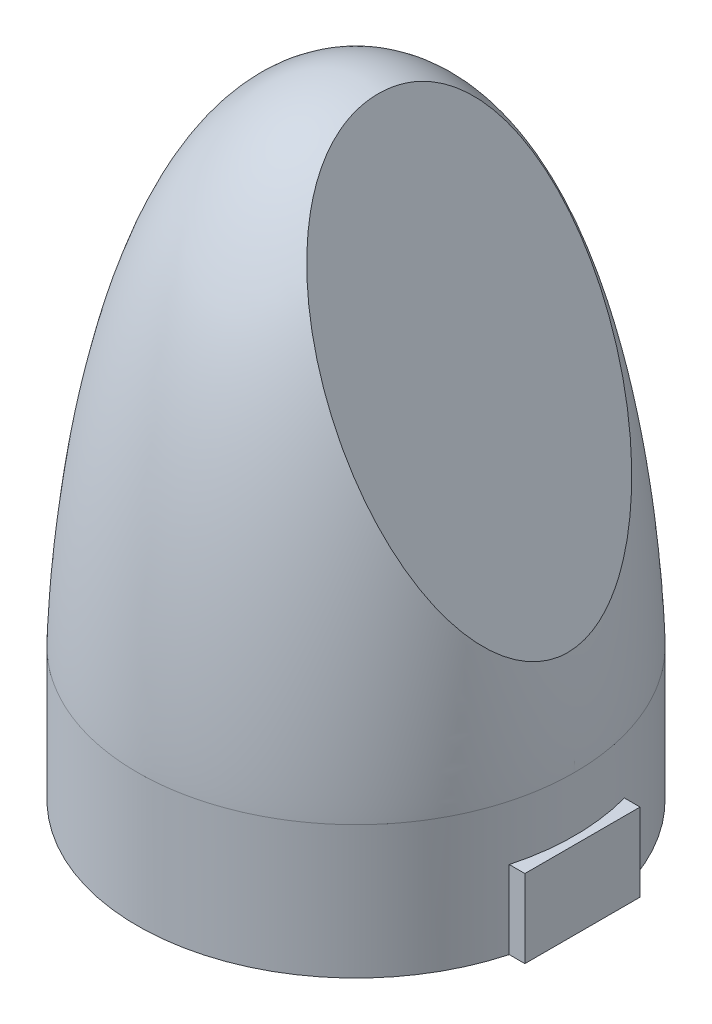
ISO-10303-21;
HEADER;
FILE_DESCRIPTION(('STEP AP214'),'2;1');
FILE_NAME('part.step','',(''),(''),'','','');
FILE_SCHEMA(('AUTOMOTIVE_DESIGN { 1 0 10303 214 1 1 1 1 }'));
ENDSEC;
DATA;
#1=APPLICATION_CONTEXT('core data for automotive mechanical design processes');
#2=APPLICATION_PROTOCOL_DEFINITION('international standard','automotive_design',2000,#1);
#3=PRODUCT_CONTEXT('',#1,'mechanical');
#4=PRODUCT('Part','Part','',(#3));
#5=PRODUCT_RELATED_PRODUCT_CATEGORY('part','',(#4));
#6=PRODUCT_DEFINITION_FORMATION('','',#4);
#7=PRODUCT_DEFINITION_CONTEXT('part definition',#1,'design');
#8=PRODUCT_DEFINITION('design','',#6,#7);
#9=PRODUCT_DEFINITION_SHAPE('','',#8);
#10=(LENGTH_UNIT() NAMED_UNIT(*) SI_UNIT(.MILLI.,.METRE.));
#11=(NAMED_UNIT(*) PLANE_ANGLE_UNIT() SI_UNIT($,.RADIAN.));
#12=(NAMED_UNIT(*) SI_UNIT($,.STERADIAN.) SOLID_ANGLE_UNIT());
#13=UNCERTAINTY_MEASURE_WITH_UNIT(LENGTH_MEASURE(1.E-05),#10,'distance_accuracy_value','');
#14=(GEOMETRIC_REPRESENTATION_CONTEXT(3) GLOBAL_UNCERTAINTY_ASSIGNED_CONTEXT((#13)) GLOBAL_UNIT_ASSIGNED_CONTEXT((#10,
#11,#12)) REPRESENTATION_CONTEXT('',''));
#15=CARTESIAN_POINT('',(0.,0.,0.));
#16=DIRECTION('',(0.,0.,1.));
#17=DIRECTION('',(1.,0.,0.));
#18=AXIS2_PLACEMENT_3D('',#15,#16,#17);
#19=CARTESIAN_POINT('',(0.,-7.91303002861502,1.63207319706783E-06));
#20=DIRECTION('',(0.,-1.,0.));
#21=DIRECTION('',(0.,0.,-1.));
#22=AXIS2_PLACEMENT_3D('',#19,#20,#21);
#23=PLANE('',#22);
#24=CARTESIAN_POINT('',(0.,-7.91303002861502,1.63207319706783E-06));
#25=DIRECTION('',(0.,-1.,0.));
#26=DIRECTION('',(0.,0.,-1.));
#27=AXIS2_PLACEMENT_3D('',#24,#25,#26);
#28=CIRCLE('',#27,14.);
#29=CARTESIAN_POINT('',(13.5051757039754,-7.91303002861502,3.68920604559537));
#30=VERTEX_POINT('',#29);
#31=CARTESIAN_POINT('',(13.5051748123092,-7.91303002861502,-3.68920604559536));
#32=VERTEX_POINT('',#31);
#33=EDGE_CURVE('E131',#30,#32,#28,.T.);
#34=ORIENTED_EDGE('',*,*,#33,.T.);
#35=DIRECTION('',(1.,0.,0.));
#36=VECTOR('',#35,1.);
#37=CARTESIAN_POINT('',(14.5067085182733,-7.91303002861502,-3.68920604559536));
#38=LINE('',#37,#36);
#39=CARTESIAN_POINT('',(14.5067085182733,-7.91303002861502,-3.68920604559536));
#40=VERTEX_POINT('',#39);
#41=EDGE_CURVE('E97',#32,#40,#38,.T.);
#42=ORIENTED_EDGE('',*,*,#41,.T.);
#43=DIRECTION('',(0.,0.,1.));
#44=VECTOR('',#43,1.);
#45=CARTESIAN_POINT('',(14.5067085182733,-7.91303002861502,-3.68920604559536));
#46=LINE('',#45,#44);
#47=CARTESIAN_POINT('',(14.5067085182733,-7.91303002861502,3.68920604559536));
#48=VERTEX_POINT('',#47);
#49=EDGE_CURVE('E102',#40,#48,#46,.T.);
#50=ORIENTED_EDGE('',*,*,#49,.T.);
#51=DIRECTION('',(-1.,0.,0.));
#52=VECTOR('',#51,1.);
#53=CARTESIAN_POINT('',(14.5067085182733,-7.91303002861502,3.68920604559536));
#54=LINE('',#53,#52);
#55=EDGE_CURVE('E49',#48,#30,#54,.T.);
#56=ORIENTED_EDGE('',*,*,#55,.T.);
#57=EDGE_LOOP('',(#34,#42,#50,#56));
#58=FACE_BOUND('',#57,.T.);
#59=ADVANCED_FACE('F35',(#58),#23,.T.);
#60=CARTESIAN_POINT('',(0.,-7.91303002861502,1.63207319706783E-06));
#61=DIRECTION('',(0.,-1.,0.));
#62=DIRECTION('',(0.,0.,-1.));
#63=AXIS2_PLACEMENT_3D('',#60,#61,#62);
#64=CYLINDRICAL_SURFACE('',#63,14.);
#65=DIRECTION('',(0.,-1.,0.));
#66=VECTOR('',#65,1.);
#67=CARTESIAN_POINT('',(13.5051748123092,-7.91303002861502,-3.68920604559536));
#68=LINE('',#67,#66);
#69=CARTESIAN_POINT('',(13.5051748123092,-2.91303002861502,-3.68920604559536));
#70=VERTEX_POINT('',#69);
#71=EDGE_CURVE('E11',#32,#70,#68,.F.);
#72=ORIENTED_EDGE('',*,*,#71,.F.);
#73=ORIENTED_EDGE('',*,*,#33,.F.);
#74=DIRECTION('',(0.,-1.,0.));
#75=VECTOR('',#74,1.);
#76=CARTESIAN_POINT('',(13.5051757039754,-7.91303002861502,3.68920604559536));
#77=LINE('',#76,#75);
#78=CARTESIAN_POINT('',(13.5051757039754,-2.91303002861502,3.68920604559536));
#79=VERTEX_POINT('',#78);
#80=EDGE_CURVE('E42',#79,#30,#77,.T.);
#81=ORIENTED_EDGE('',*,*,#80,.F.);
#82=CARTESIAN_POINT('',(0.,-2.91303002861502,1.63207319706783E-06));
#83=DIRECTION('',(0.,-1.,0.));
#84=DIRECTION('',(0.,0.,-1.));
#85=AXIS2_PLACEMENT_3D('',#82,#83,#84);
#86=CIRCLE('',#85,14.);
#87=EDGE_CURVE('E92',#79,#70,#86,.F.);
#88=ORIENTED_EDGE('',*,*,#87,.T.);
#89=EDGE_LOOP('',(#72,#73,#81,#88));
#90=FACE_BOUND('',#89,.T.);
#91=CARTESIAN_POINT('',(0.,0.599554023441105,1.63207319706783E-06));
#92=DIRECTION('',(0.,-1.,0.));
#93=DIRECTION('',(0.,0.,-1.));
#94=AXIS2_PLACEMENT_3D('',#91,#92,#93);
#95=CIRCLE('',#94,14.);
#96=CARTESIAN_POINT('',(0.,0.599554023441105,-13.9999983679268));
#97=VERTEX_POINT('',#96);
#98=EDGE_CURVE('E105',#97,#97,#95,.T.);
#99=ORIENTED_EDGE('',*,*,#98,.T.);
#100=EDGE_LOOP('',(#99));
#101=FACE_BOUND('',#100,.T.);
#102=ADVANCED_FACE('F121',(#90,#101),#64,.T.);
#103=CARTESIAN_POINT('',(14.,0.599554023441091,1.63207319706783E-06));
#104=CARTESIAN_POINT('',(14.0101192378029,0.600297963765106,1.63207319706783E-06));
#105=CARTESIAN_POINT('',(13.497519718667,32.0535501950033,1.63207319706783E-06));
#106=CARTESIAN_POINT('',(0.,32.086969971385,1.63207319706783E-06));
#107=B_SPLINE_CURVE_WITH_KNOTS('',3,(#103,#104,#105,#106),.UNSPECIFIED.,.F.,.F.,(4,4),(0.,
0.166417438268429),.UNSPECIFIED.);
#108=CARTESIAN_POINT('',(0.,-7.91303002861502,1.63207319706783E-06));
#109=DIRECTION('',(0.,-1.,0.));
#110=AXIS1_PLACEMENT('',#108,#109);
#111=SURFACE_OF_REVOLUTION('',#107,#110);
#112=CARTESIAN_POINT('',(13.5695925705618,7.03495349548713,1.63207319706783E-06));
#113=CARTESIAN_POINT('',(13.569593111081,7.03495238615009,-0.115935962691736));
#114=CARTESIAN_POINT('',(13.5677017376389,7.03883415783024,-0.231863789741345));
#115=CARTESIAN_POINT('',(13.5601689966265,7.05429402421619,-0.463113613480936));
#116=CARTESIAN_POINT('',(13.554526715549,7.06587399376377,-0.57843545569004));
#117=CARTESIAN_POINT('',(13.5395854771663,7.09653873433856,-0.807815068448769));
#118=CARTESIAN_POINT('',(13.5302870646289,7.11562238730826,-0.921873024716839));
#119=CARTESIAN_POINT('',(13.5081808067805,7.16099229873516,-1.14820576316821));
#120=CARTESIAN_POINT('',(13.4953725740684,7.18727935227742,-1.26048034706125));
#121=CARTESIAN_POINT('',(13.4641002184667,7.25146135962925,-1.50069596285211));
#122=CARTESIAN_POINT('',(13.445057217935,7.290544376454,-1.62824524834484));
#123=CARTESIAN_POINT('',(13.4028369903689,7.37719531476394,-1.87970464842254));
#124=CARTESIAN_POINT('',(13.3796594396676,7.4247639005289,-2.00361447721312));
#125=CARTESIAN_POINT('',(13.3044455699655,7.57912953897566,-2.36935766905935));
#126=CARTESIAN_POINT('',(13.246734797026,7.69757259137201,-2.60515453007807));
#127=CARTESIAN_POINT('',(13.0792809463252,8.04124751032234,-3.20033229330516));
#128=CARTESIAN_POINT('',(12.9595386182557,8.28700139846505,-3.54503548701057));
#129=CARTESIAN_POINT('',(12.7636289989305,8.68907768552191,-4.02670415129678));
#130=CARTESIAN_POINT('',(12.6954726018878,8.82895887745364,-4.18160892362818));
#131=CARTESIAN_POINT('',(12.5545870920375,9.11810610205571,-4.48024095883491));
#132=CARTESIAN_POINT('',(12.4818581996817,9.26737168228025,-4.62396875983492));
#133=CARTESIAN_POINT('',(12.2844743172951,9.67247368200985,-4.99014958880977));
#134=CARTESIAN_POINT('',(12.1565984209263,9.93492054803463,-5.20354939246708));
#135=CARTESIAN_POINT('',(11.8932504340534,10.4754043748651,-5.60440398331515));
#136=CARTESIAN_POINT('',(11.7577734255069,10.7534514292443,-5.79184169415517));
#137=CARTESIAN_POINT('',(11.4809120363106,11.3216695687154,-6.14336078578195));
#138=CARTESIAN_POINT('',(11.3395195596337,11.6118572697371,-6.30740870595594));
#139=CARTESIAN_POINT('',(11.0523536226196,12.2012240099798,-6.61387427767249));
#140=CARTESIAN_POINT('',(10.9065806627114,12.5004020221419,-6.75629438882122));
#141=CARTESIAN_POINT('',(10.6372145804181,13.0532371233513,-6.99819389175374));
#142=CARTESIAN_POINT('',(10.5141615078226,13.3057858379604,-7.10083629662205));
#143=CARTESIAN_POINT('',(10.266126712572,13.8148415437434,-7.2932553568146));
#144=CARTESIAN_POINT('',(10.1411447494743,14.0713490283912,-7.38303039359384));
#145=CARTESIAN_POINT('',(9.88955921589693,14.5876921133629,-7.55034430684583));
#146=CARTESIAN_POINT('',(9.76295491160109,14.8475292197389,-7.62787741847709));
#147=CARTESIAN_POINT('',(9.50846584128399,15.3698313958245,-7.77113080345647));
#148=CARTESIAN_POINT('',(9.38058093973396,15.6322967436874,-7.83684981223705));
#149=CARTESIAN_POINT('',(8.99480154315081,16.4240534115604,-8.01711777693927));
#150=CARTESIAN_POINT('',(8.73532783324459,16.9565858427259,-8.11441970486723));
#151=CARTESIAN_POINT('',(8.21402709922825,18.0264805436358,-8.26468524020296));
#152=CARTESIAN_POINT('',(7.9522006932991,18.5638415446527,-8.31766016917724));
#153=CARTESIAN_POINT('',(7.50750902556991,19.4765071670022,-8.3699952668589));
#154=CARTESIAN_POINT('',(7.3248886181778,19.851309259916,-8.38077243905584));
#155=CARTESIAN_POINT('',(6.95961564994763,20.600979436062,-8.38055717645193));
#156=CARTESIAN_POINT('',(6.77696308799601,20.9758475215797,-8.36956194015509));
#157=CARTESIAN_POINT('',(6.41209728568607,21.7246820482973,-8.32505448639336));
#158=CARTESIAN_POINT('',(6.2298842785092,22.0986480109258,-8.29153219449331));
#159=CARTESIAN_POINT('',(5.86728178438736,22.8428374234531,-8.20100542017854));
#160=CARTESIAN_POINT('',(5.68688796714474,23.2130697606643,-8.14409244609434));
#161=CARTESIAN_POINT('',(5.32801042257246,23.9496142505506,-8.00526690446767));
#162=CARTESIAN_POINT('',(5.14952600360483,24.3159278227131,-7.92336372996598));
#163=CARTESIAN_POINT('',(4.79546508716638,25.0425868768416,-7.73257352089771));
#164=CARTESIAN_POINT('',(4.61988621207603,25.4029372385294,-7.62370984497012));
#165=CARTESIAN_POINT('',(4.32539240445965,26.0073433781334,-7.41386222117222));
#166=CARTESIAN_POINT('',(4.20543298191147,26.2535428214368,-7.32049117738945));
#167=CARTESIAN_POINT('',(3.96803166737841,26.7407748390308,-7.11829744784054));
#168=CARTESIAN_POINT('',(3.8505895611237,26.9818078530792,-7.00947608323993));
#169=CARTESIAN_POINT('',(3.61893639897148,27.4572426155169,-6.77520540763167));
#170=CARTESIAN_POINT('',(3.50472486699324,27.6916453409934,-6.64975856232959));
#171=CARTESIAN_POINT('',(3.28041196295403,28.1520152804874,-6.38092333942188));
#172=CARTESIAN_POINT('',(3.17031008170108,28.3779835395481,-6.23753719416755));
#173=CARTESIAN_POINT('',(2.97233370093599,28.7843015568928,-5.95566371149793));
#174=CARTESIAN_POINT('',(2.88369496884013,28.9662197925226,-5.81997899186252));
#175=CARTESIAN_POINT('',(2.71097024865626,29.3207124121993,-5.53417658929666));
#176=CARTESIAN_POINT('',(2.62688431465721,29.4932866852365,-5.3840587349539));
#177=CARTESIAN_POINT('',(2.46439058944298,29.8267816607728,-5.06903302195973));
#178=CARTESIAN_POINT('',(2.38597475201658,29.9877188769619,-4.90414689556671));
#179=CARTESIAN_POINT('',(2.23585880587704,30.295810243071,-4.55912921760212));
#180=CARTESIAN_POINT('',(2.16415669826374,30.4429684954458,-4.37900223433969));
#181=CARTESIAN_POINT('',(2.04407670479046,30.6894153932135,-4.04623563313655));
#182=CARTESIAN_POINT('',(1.99409396407966,30.7919977721245,-3.89660869369195));
#183=CARTESIAN_POINT('',(1.89950679623883,30.9861243156789,-3.58873506093898));
#184=CARTESIAN_POINT('',(1.85490163983911,31.0776699770434,-3.43048954065627));
#185=CARTESIAN_POINT('',(1.77167157698174,31.2484876977887,-3.10613254633115));
#186=CARTESIAN_POINT('',(1.73304254743913,31.3277682192077,-2.94002659965607));
#187=CARTESIAN_POINT('',(1.6622250457882,31.4731109452082,-2.60077902038431));
#188=CARTESIAN_POINT('',(1.63003697730049,31.5391723214165,-2.42763694768865));
#189=CARTESIAN_POINT('',(1.57239630370753,31.6574715049969,-2.07499721271673));
#190=CARTESIAN_POINT('',(1.5469645056908,31.7096666088155,-1.89548180369488));
#191=CARTESIAN_POINT('',(1.50319858550568,31.7994898586808,-1.53204197155543));
#192=CARTESIAN_POINT('',(1.48486287171623,31.8371212713005,-1.34811854697623));
#193=CARTESIAN_POINT('',(1.4553448581792,31.8977027441508,-0.977183425601441));
#194=CARTESIAN_POINT('',(1.44416738569824,31.9206428971117,-0.790169731837354));
#195=CARTESIAN_POINT('',(1.42895044362931,31.9518734798085,-0.414434108559467));
#196=CARTESIAN_POINT('',(1.42491874127721,31.9601479684111,-0.225710544068186));
#197=CARTESIAN_POINT('',(1.42400690458217,31.9620193819436,0.143930900312275));
#198=CARTESIAN_POINT('',(1.42683495728801,31.9562152109413,0.324845403956373));
#199=CARTESIAN_POINT('',(1.43906204675914,31.9311208702295,0.685594032731897));
#200=CARTESIAN_POINT('',(1.44846373484193,31.9118252590726,0.865427692403453));
#201=CARTESIAN_POINT('',(1.47386751976268,31.8596876481002,1.22259303149525));
#202=CARTESIAN_POINT('',(1.48986741936465,31.8268501577952,1.39992552350496));
#203=CARTESIAN_POINT('',(1.52841999257066,31.747726551999,1.75075483186491));
#204=CARTESIAN_POINT('',(1.55096965696794,31.7014466124715,1.92425337037416));
#205=CARTESIAN_POINT('',(1.60251080753621,31.5956658217043,2.26655146825602));
#206=CARTESIAN_POINT('',(1.63151431501456,31.536140298462,2.43534158843063));
#207=CARTESIAN_POINT('',(1.69561194785318,31.4045891356878,2.76659689286819));
#208=CARTESIAN_POINT('',(1.73070079466112,31.3325743296244,2.92906741057632));
#209=CARTESIAN_POINT('',(1.80660384093532,31.1767942554895,3.24703533186243));
#210=CARTESIAN_POINT('',(1.8474225594887,31.0930197126422,3.40252710238237));
#211=CARTESIAN_POINT('',(1.9342792128042,30.9147589371296,3.7057561851056));
#212=CARTESIAN_POINT('',(1.98031889289173,30.8202691224352,3.85349087989193));
#213=CARTESIAN_POINT('',(2.09137058659041,30.5923515100814,4.18314937232851));
#214=CARTESIAN_POINT('',(2.1579714171975,30.455662894292,4.36229317581793));
#215=CARTESIAN_POINT('',(2.29784576848922,30.1685909270472,4.70635476095048));
#216=CARTESIAN_POINT('',(2.37112079142655,30.0182044924345,4.8712693234749));
#217=CARTESIAN_POINT('',(2.59957135235512,29.5493426079053,5.34532503044854));
#218=CARTESIAN_POINT('',(2.7632364540971,29.2134435506978,5.63338815709374));
#219=CARTESIAN_POINT('',(3.06335253823984,28.5974984980057,6.09218704505054));
#220=CARTESIAN_POINT('',(3.19657895696239,28.3240704552054,6.27434608299585));
#221=CARTESIAN_POINT('',(3.46954956358874,27.7638375867734,6.61153737880839));
#222=CARTESIAN_POINT('',(3.60929705867246,27.477025973631,6.76655567858261));
#223=CARTESIAN_POINT('',(3.89375799365458,26.8932108605993,7.0519015053211));
#224=CARTESIAN_POINT('',(4.03847903035531,26.596191769367,7.18218907978723));
#225=CARTESIAN_POINT('',(4.33144124331907,25.9949290072721,7.41996343650344));
#226=CARTESIAN_POINT('',(4.47968223138939,25.690685722648,7.52745143468478));
#227=CARTESIAN_POINT('',(4.74953643860886,25.1368488153067,7.70252116722886));
#228=CARTESIAN_POINT('',(4.8706956287262,24.8881870218073,7.77379676397444));
#229=CARTESIAN_POINT('',(5.1143235547424,24.3881757806371,7.90359441569345));
#230=CARTESIAN_POINT('',(5.2367924458304,24.1368260144631,7.96211494132658));
#231=CARTESIAN_POINT('',(5.60577897053224,23.3795342983281,8.11964016622769));
#232=CARTESIAN_POINT('',(5.85380816803834,22.8704900811097,8.20056527427735));
#233=CARTESIAN_POINT('',(6.3522920829253,21.8474236163507,8.31844954376962));
#234=CARTESIAN_POINT('',(6.6027507181833,21.3333933279313,8.35531861474772));
#235=CARTESIAN_POINT('',(7.10411240815579,20.3044206441446,8.38740792799201));
#236=CARTESIAN_POINT('',(7.35501534963813,19.7894784811699,8.38263758108016));
#237=CARTESIAN_POINT('',(7.86820809565897,18.7362242582516,8.33154894644731));
#238=CARTESIAN_POINT('',(8.13045916712688,18.1979916923587,8.28322423973561));
#239=CARTESIAN_POINT('',(8.65278910521417,17.1259846982756,8.14224487167148));
#240=CARTESIAN_POINT('',(8.91286730109274,16.5922116466843,8.04957700171914));
#241=CARTESIAN_POINT('',(9.29961079452184,15.7984763088434,7.8764022991751));
#242=CARTESIAN_POINT('',(9.42778886701671,15.5354092698263,7.81309245066583));
#243=CARTESIAN_POINT('',(9.68291880517343,15.0117918047705,7.6747310952471));
#244=CARTESIAN_POINT('',(9.80987080234767,14.7512411088216,7.59968086283597));
#245=CARTESIAN_POINT('',(10.0621937686621,14.2333845493308,7.43744414210311));
#246=CARTESIAN_POINT('',(10.1875656885015,13.9760767346159,7.3502653727918));
#247=CARTESIAN_POINT('',(10.4364851752332,13.4652053269437,7.16315043942667));
#248=CARTESIAN_POINT('',(10.5600326245051,13.2116419753856,7.0632134568438));
#249=CARTESIAN_POINT('',(10.8040661526837,12.7107982941748,6.85057826620381));
#250=CARTESIAN_POINT('',(10.92456715733,12.4634873315906,6.73796965042831));
#251=CARTESIAN_POINT('',(11.1628254349411,11.9744965206626,6.49861874455362));
#252=CARTESIAN_POINT('',(11.2805833119411,11.7328154326234,6.37187960224371));
#253=CARTESIAN_POINT('',(11.5128018208414,11.2562203773825,6.1031370649898));
#254=CARTESIAN_POINT('',(11.6272606786049,11.0213100513411,5.96112564425124));
#255=CARTESIAN_POINT('',(11.8519750623534,10.560116132548,5.66067443128469));
#256=CARTESIAN_POINT('',(11.9622311237976,10.3338314408431,5.50223674148624));
#257=CARTESIAN_POINT('',(12.1605913108195,9.92672571641578,5.19372675425537));
#258=CARTESIAN_POINT('',(12.2494613104783,9.74433283741064,5.04622738554583));
#259=CARTESIAN_POINT('',(12.4225816229001,9.38902832162186,4.7375908912396));
#260=CARTESIAN_POINT('',(12.5068313307808,9.21611792627239,4.5764519869635));
#261=CARTESIAN_POINT('',(12.6694427131064,8.88238147645509,4.23993495336355));
#262=CARTESIAN_POINT('',(12.7478153519104,8.7215329192187,4.06458467704947));
#263=CARTESIAN_POINT('',(12.8973860850233,8.41456052434844,3.69876743748846));
#264=CARTESIAN_POINT('',(12.9685883297078,8.26842816866593,3.5083093344417));
#265=CARTESIAN_POINT('',(13.1200427664086,7.95758974339257,3.0584135627423));
#266=CARTESIAN_POINT('',(13.1976275609072,7.79835812316113,2.79414473234098));
#267=CARTESIAN_POINT('',(13.2999280962746,7.58840100331087,2.37992786858826));
#268=CARTESIAN_POINT('',(13.3316784206356,7.52323803389727,2.23890935830274));
#269=CARTESIAN_POINT('',(13.3899211837091,7.40370314834548,1.95127658335797));
#270=CARTESIAN_POINT('',(13.4164142190157,7.34933000778398,1.8046629558832));
#271=CARTESIAN_POINT('',(13.4609372672647,7.25795286157722,1.52307037300803));
#272=CARTESIAN_POINT('',(13.4795788535589,7.21969368968032,1.38859514756734));
#273=CARTESIAN_POINT('',(13.5118472849967,7.15346738008702,1.1165488122648));
#274=CARTESIAN_POINT('',(13.5254750345172,7.12549838628728,0.978978265480491));
#275=CARTESIAN_POINT('',(13.5474031260014,7.0804941356726,0.701736180914162));
#276=CARTESIAN_POINT('',(13.5557073238617,7.06345096518501,0.562066238959865));
#277=CARTESIAN_POINT('',(13.5668013644393,7.0406820441885,0.281593175660219));
#278=CARTESIAN_POINT('',(13.5695919141836,7.0349548426082,0.140790201931328));
#279=CARTESIAN_POINT('',(13.5695925705618,7.03495349548713,1.63207319706783E-06));
#280=B_SPLINE_CURVE_WITH_KNOTS('',3,(#112,#113,#114,#115,#116,#117,#118,#119,#120,#121,#122,
#123,#124,#125,#126,#127,#128,#129,#130,#131,#132,#133,#134,#135,#136,#137,#138,#139,#140,#141,
#142,#143,#144,#145,#146,#147,#148,#149,#150,#151,#152,#153,#154,#155,#156,#157,#158,#159,#160,
#161,#162,#163,#164,#165,#166,#167,#168,#169,#170,#171,#172,#173,#174,#175,#176,#177,#178,#179,
#180,#181,#182,#183,#184,#185,#186,#187,#188,#189,#190,#191,#192,#193,#194,#195,#196,#197,#198,
#199,#200,#201,#202,#203,#204,#205,#206,#207,#208,#209,#210,#211,#212,#213,#214,#215,#216,#217,
#218,#219,#220,#221,#222,#223,#224,#225,#226,#227,#228,#229,#230,#231,#232,#233,#234,#235,#236,
#237,#238,#239,#240,#241,#242,#243,#244,#245,#246,#247,#248,#249,#250,#251,#252,#253,#254,#255,
#256,#257,#258,#259,#260,#261,#262,#263,#264,#265,#266,#267,#268,#269,#270,#271,#272,#273,#274,
#275,#276,#277,#278,#279),.UNSPECIFIED.,.T.,.F.,(4,2,2,2,2,2,2,2,2,2,2,2,2,2,2,2,2,2,2,2,2,2,2,
2,2,2,2,2,2,2,2,2,2,2,2,2,2,2,2,2,2,2,2,2,2,2,2,2,2,2,2,2,2,2,2,2,2,2,2,2,2,2,2,2,2,2,2,2,2,2,2,
2,2,2,2,2,2,2,2,2,2,2,2,4),(0.,0.347716159295487,0.695517033447526,1.04326610449338,
1.39105357428383,1.79489885053381,2.19877575507835,3.00668561334551,4.31863896660072,
4.97698506260486,5.63529944233445,6.71845257087879,7.80231478519259,8.88771230315853,
9.9729862925272,10.869959226273,11.7670448885374,12.6645517452688,13.5621546129397,
15.361236622299,17.1598589874283,18.4105347677635,19.6613714853184,20.9127679683081,
22.1593146846205,23.4053934386869,24.6503963412783,25.5180391595039,26.3856078297446,
27.2530479755795,28.1203802850605,28.8507355379243,29.5810994657818,30.3104057509034,
31.0394942022567,31.6034758257574,32.1673808798473,32.7308951293137,33.2944446801544,
33.8597101705905,34.4248488008347,34.9903681405291,35.5565018065167,36.0989775852064,
36.6416722847401,37.184186410088,37.7264516773611,38.2697355829064,38.8125505682474,
39.3557960966384,39.8992237659745,40.6030565974783,41.3070482437074,42.7165081976705,
43.7788479284005,44.8417324105679,45.9063196353858,46.9708500700895,47.827470522614,
48.6841936279862,50.3981235060452,52.1155522446967,53.8325928415745,55.6330171013461,
57.4339779917843,58.3319896268071,59.2299038441365,60.1272491907471,61.0246521373281,
61.9160675712029,62.8072848240269,63.6989727339226,64.5905466555466,65.3425542907281,
66.0946601438667,66.8453260200137,67.5955548668726,68.5462965756788,69.0215234510275,
69.4966963670369,69.919381622714,70.3419905986029,70.7642931281065,71.18654150132),.UNSPECIFIED.);
#281=CARTESIAN_POINT('',(13.5695925705618,7.03495349548713,1.63207319706783E-06));
#282=VERTEX_POINT('',#281);
#283=EDGE_CURVE('E126',#282,#282,#280,.T.);
#284=ORIENTED_EDGE('',*,*,#283,.F.);
#285=EDGE_LOOP('',(#284));
#286=FACE_BOUND('',#285,.T.);
#287=CARTESIAN_POINT('',(0.,32.086969971385,1.63207319706783E-06));
#288=VERTEX_POINT('',#287);
#289=VERTEX_LOOP('',#288);
#290=FACE_BOUND('',#289,.T.);
#291=ORIENTED_EDGE('',*,*,#98,.F.);
#292=EDGE_LOOP('',(#291));
#293=FACE_BOUND('',#292,.T.);
#294=ADVANCED_FACE('F116',(#286,#290,#293),#111,.F.);
#295=CARTESIAN_POINT('',(1.42440752605615,31.9611971640488,-14.0050579868282));
#296=DIRECTION('',(-0.898966715538194,-0.438016945282341,0.));
#297=DIRECTION('',(0.438016945282341,-0.898966715538194,0.));
#298=AXIS2_PLACEMENT_3D('',#295,#296,#297);
#299=PLANE('',#298);
#300=ORIENTED_EDGE('',*,*,#283,.T.);
#301=EDGE_LOOP('',(#300));
#302=FACE_BOUND('',#301,.T.);
#303=ADVANCED_FACE('F120',(#302),#299,.F.);
#304=CARTESIAN_POINT('',(14.5067085182733,-2.91303002861502,-3.68920604559536));
#305=DIRECTION('',(1.,0.,0.));
#306=DIRECTION('',(0.,0.,-1.));
#307=AXIS2_PLACEMENT_3D('',#304,#305,#306);
#308=PLANE('',#307);
#309=ORIENTED_EDGE('',*,*,#49,.F.);
#310=DIRECTION('',(0.,-1.,0.));
#311=VECTOR('',#310,1.);
#312=CARTESIAN_POINT('',(14.5067085182733,-2.91303002861502,-3.68920604559536));
#313=LINE('',#312,#311);
#314=CARTESIAN_POINT('',(14.5067085182733,-2.91303002861502,-3.68920604559536));
#315=VERTEX_POINT('',#314);
#316=EDGE_CURVE('E83',#315,#40,#313,.T.);
#317=ORIENTED_EDGE('',*,*,#316,.F.);
#318=DIRECTION('',(0.,0.,1.));
#319=VECTOR('',#318,1.);
#320=CARTESIAN_POINT('',(14.5067085182733,-2.91303002861502,-3.68920604559536));
#321=LINE('',#320,#319);
#322=CARTESIAN_POINT('',(14.5067085182733,-2.91303002861502,3.68920604559536));
#323=VERTEX_POINT('',#322);
#324=EDGE_CURVE('E90',#315,#323,#321,.T.);
#325=ORIENTED_EDGE('',*,*,#324,.T.);
#326=DIRECTION('',(0.,-1.,0.));
#327=VECTOR('',#326,1.);
#328=CARTESIAN_POINT('',(14.5067085182733,-2.91303002861502,3.68920604559536));
#329=LINE('',#328,#327);
#330=EDGE_CURVE('E75',#323,#48,#329,.T.);
#331=ORIENTED_EDGE('',*,*,#330,.T.);
#332=EDGE_LOOP('',(#309,#317,#325,#331));
#333=FACE_BOUND('',#332,.T.);
#334=ADVANCED_FACE('F95',(#333),#308,.T.);
#335=CARTESIAN_POINT('',(14.5067085182733,-2.91303002861502,-3.68920604559536));
#336=DIRECTION('',(0.,0.,-1.));
#337=DIRECTION('',(-1.,0.,0.));
#338=AXIS2_PLACEMENT_3D('',#335,#336,#337);
#339=PLANE('',#338);
#340=ORIENTED_EDGE('',*,*,#41,.F.);
#341=ORIENTED_EDGE('',*,*,#71,.T.);
#342=DIRECTION('',(1.,0.,0.));
#343=VECTOR('',#342,1.);
#344=CARTESIAN_POINT('',(14.5067085182733,-2.91303002861502,-3.68920604559536));
#345=LINE('',#344,#343);
#346=EDGE_CURVE('E84',#70,#315,#345,.T.);
#347=ORIENTED_EDGE('',*,*,#346,.T.);
#348=ORIENTED_EDGE('',*,*,#316,.T.);
#349=EDGE_LOOP('',(#340,#341,#347,#348));
#350=FACE_BOUND('',#349,.T.);
#351=ADVANCED_FACE('F154',(#350),#339,.T.);
#352=CARTESIAN_POINT('',(14.5067085182733,-2.91303002861502,3.68920604559536));
#353=DIRECTION('',(0.,0.,1.));
#354=DIRECTION('',(1.,0.,0.));
#355=AXIS2_PLACEMENT_3D('',#352,#353,#354);
#356=PLANE('',#355);
#357=DIRECTION('',(-1.,0.,0.));
#358=VECTOR('',#357,1.);
#359=CARTESIAN_POINT('',(14.5067085182733,-2.91303002861502,3.68920604559536));
#360=LINE('',#359,#358);
#361=EDGE_CURVE('E78',#323,#79,#360,.T.);
#362=ORIENTED_EDGE('',*,*,#361,.T.);
#363=ORIENTED_EDGE('',*,*,#80,.T.);
#364=ORIENTED_EDGE('',*,*,#55,.F.);
#365=ORIENTED_EDGE('',*,*,#330,.F.);
#366=EDGE_LOOP('',(#362,#363,#364,#365));
#367=FACE_BOUND('',#366,.T.);
#368=ADVANCED_FACE('F77',(#367),#356,.T.);
#369=CARTESIAN_POINT('',(0.,-2.91303002861502,0.));
#370=DIRECTION('',(0.,-1.,0.));
#371=DIRECTION('',(0.,0.,-1.));
#372=AXIS2_PLACEMENT_3D('',#369,#370,#371);
#373=PLANE('',#372);
#374=ORIENTED_EDGE('',*,*,#87,.F.);
#375=ORIENTED_EDGE('',*,*,#361,.F.);
#376=ORIENTED_EDGE('',*,*,#324,.F.);
#377=ORIENTED_EDGE('',*,*,#346,.F.);
#378=EDGE_LOOP('',(#374,#375,#376,#377));
#379=FACE_BOUND('',#378,.T.);
#380=ADVANCED_FACE('F88',(#379),#373,.F.);
#381=CLOSED_SHELL('',(#59,#102,#294,#303,#334,#351,#368,#380));
#382=MANIFOLD_SOLID_BREP('B2',#381);
#383=ADVANCED_BREP_SHAPE_REPRESENTATION('',(#18,#382),#14);
#384=SHAPE_DEFINITION_REPRESENTATION(#9,#383);
ENDSEC;
END-ISO-10303-21;
